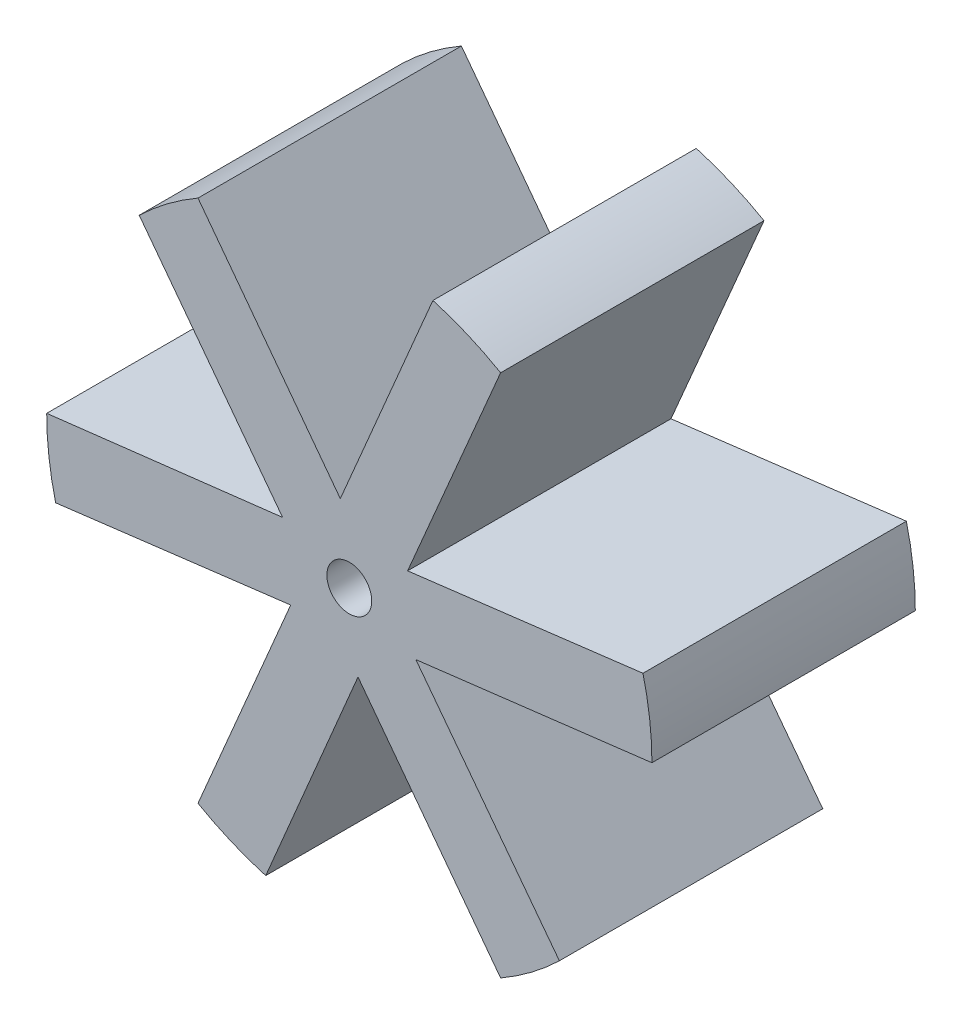
ISO-10303-21;
HEADER;
FILE_DESCRIPTION(('STEP AP214'),'2;1');
FILE_NAME('part.step','',(''),(''),'','','');
FILE_SCHEMA(('AUTOMOTIVE_DESIGN { 1 0 10303 214 1 1 1 1 }'));
ENDSEC;
DATA;
#1=APPLICATION_CONTEXT('core data for automotive mechanical design processes');
#2=APPLICATION_PROTOCOL_DEFINITION('international standard','automotive_design',2000,#1);
#3=PRODUCT_CONTEXT('',#1,'mechanical');
#4=PRODUCT('Part','Part','',(#3));
#5=PRODUCT_RELATED_PRODUCT_CATEGORY('part','',(#4));
#6=PRODUCT_DEFINITION_FORMATION('','',#4);
#7=PRODUCT_DEFINITION_CONTEXT('part definition',#1,'design');
#8=PRODUCT_DEFINITION('design','',#6,#7);
#9=PRODUCT_DEFINITION_SHAPE('','',#8);
#10=(LENGTH_UNIT() NAMED_UNIT(*) SI_UNIT(.MILLI.,.METRE.));
#11=(NAMED_UNIT(*) PLANE_ANGLE_UNIT() SI_UNIT($,.RADIAN.));
#12=(NAMED_UNIT(*) SI_UNIT($,.STERADIAN.) SOLID_ANGLE_UNIT());
#13=UNCERTAINTY_MEASURE_WITH_UNIT(LENGTH_MEASURE(1.E-05),#10,'distance_accuracy_value','');
#14=(GEOMETRIC_REPRESENTATION_CONTEXT(3) GLOBAL_UNCERTAINTY_ASSIGNED_CONTEXT((#13)) GLOBAL_UNIT_ASSIGNED_CONTEXT((#10,
#11,#12)) REPRESENTATION_CONTEXT('',''));
#15=CARTESIAN_POINT('',(0.,0.,0.));
#16=DIRECTION('',(0.,0.,1.));
#17=DIRECTION('',(1.,0.,0.));
#18=AXIS2_PLACEMENT_3D('',#15,#16,#17);
#19=CARTESIAN_POINT('',(2.6131041628514,1.96600077533102,23.5));
#20=DIRECTION('',(0.799093034570553,0.601207386931352,0.));
#21=DIRECTION('',(-0.601207386931352,0.799093034570553,0.));
#22=AXIS2_PLACEMENT_3D('',#19,#20,#21);
#23=PLANE('',#22);
#24=DIRECTION('',(0.601207386931352,-0.799093034570553,0.));
#25=VECTOR('',#24,1.);
#26=CARTESIAN_POINT('',(2.6131041628514,1.96600077533102,0.));
#27=LINE('',#26,#25);
#28=CARTESIAN_POINT('',(-13.5,23.3826859021798,0.));
#29=VERTEX_POINT('',#28);
#30=CARTESIAN_POINT('',(-0.802395417940144,6.5057020230484,0.));
#31=VERTEX_POINT('',#30);
#32=EDGE_CURVE('E200',#29,#31,#27,.T.);
#33=ORIENTED_EDGE('',*,*,#32,.F.);
#34=DIRECTION('',(0.,0.,-1.));
#35=VECTOR('',#34,1.);
#36=CARTESIAN_POINT('',(-13.5,23.3826859021798,23.5));
#37=LINE('',#36,#35);
#38=CARTESIAN_POINT('',(-13.5,23.3826859021798,23.5));
#39=VERTEX_POINT('',#38);
#40=EDGE_CURVE('E11',#39,#29,#37,.T.);
#41=ORIENTED_EDGE('',*,*,#40,.F.);
#42=DIRECTION('',(0.601207386931352,-0.799093034570553,0.));
#43=VECTOR('',#42,1.);
#44=CARTESIAN_POINT('',(2.6131041628514,1.96600077533102,23.5));
#45=LINE('',#44,#43);
#46=CARTESIAN_POINT('',(-0.802395417940144,6.5057020230484,23.5));
#47=VERTEX_POINT('',#46);
#48=EDGE_CURVE('E263',#39,#47,#45,.T.);
#49=ORIENTED_EDGE('',*,*,#48,.T.);
#50=DIRECTION('',(0.,0.,-1.));
#51=VECTOR('',#50,1.);
#52=CARTESIAN_POINT('',(-0.802395417940144,6.5057020230484,23.5));
#53=LINE('',#52,#51);
#54=EDGE_CURVE('E121',#47,#31,#53,.T.);
#55=ORIENTED_EDGE('',*,*,#54,.T.);
#56=EDGE_LOOP('',(#33,#41,#49,#55));
#57=FACE_BOUND('',#56,.T.);
#58=ADVANCED_FACE('F40',(#57),#23,.T.);
#59=CARTESIAN_POINT('',(0.,0.,23.5));
#60=DIRECTION('',(0.,0.,-1.));
#61=DIRECTION('',(-1.,0.,0.));
#62=AXIS2_PLACEMENT_3D('',#59,#60,#61);
#63=CYLINDRICAL_SURFACE('',#62,27.);
#64=CARTESIAN_POINT('',(0.,0.,0.));
#65=DIRECTION('',(0.,0.,1.));
#66=DIRECTION('',(1.,0.,0.));
#67=AXIS2_PLACEMENT_3D('',#64,#65,#66);
#68=CIRCLE('',#67,27.);
#69=CARTESIAN_POINT('',(-18.7440472603665,19.4334940836986,0.));
#70=VERTEX_POINT('',#69);
#71=EDGE_CURVE('E204',#29,#70,#68,.T.);
#72=ORIENTED_EDGE('',*,*,#71,.T.);
#73=DIRECTION('',(0.,0.,-1.));
#74=VECTOR('',#73,1.);
#75=CARTESIAN_POINT('',(-18.7440472603665,19.4334940836986,23.5));
#76=LINE('',#75,#74);
#77=CARTESIAN_POINT('',(-18.7440472603665,19.4334940836986,23.5));
#78=VERTEX_POINT('',#77);
#79=EDGE_CURVE('E49',#78,#70,#76,.T.);
#80=ORIENTED_EDGE('',*,*,#79,.F.);
#81=CARTESIAN_POINT('',(0.,0.,23.5));
#82=DIRECTION('',(0.,0.,1.));
#83=DIRECTION('',(1.,0.,0.));
#84=AXIS2_PLACEMENT_3D('',#81,#82,#83);
#85=CIRCLE('',#84,27.);
#86=EDGE_CURVE('E338',#39,#78,#85,.T.);
#87=ORIENTED_EDGE('',*,*,#86,.F.);
#88=ORIENTED_EDGE('',*,*,#40,.T.);
#89=EDGE_LOOP('',(#72,#80,#87,#88));
#90=FACE_BOUND('',#89,.T.);
#91=ADVANCED_FACE('F404',(#90),#63,.T.);
#92=CARTESIAN_POINT('',(-2.59902119357171,-1.96128524075955,23.5));
#93=DIRECTION('',(0.798224619097573,0.602359906921546,0.));
#94=DIRECTION('',(-0.602359906921547,0.798224619097573,0.));
#95=AXIS2_PLACEMENT_3D('',#92,#93,#94);
#96=PLANE('',#95);
#97=DIRECTION('',(0.602359906921547,-0.798224619097573,0.));
#98=VECTOR('',#97,1.);
#99=CARTESIAN_POINT('',(-2.59902119357171,-1.96128524075955,0.));
#100=LINE('',#99,#98);
#101=CARTESIAN_POINT('',(-5.95313422123392,2.48345877880644,0.));
#102=VERTEX_POINT('',#101);
#103=EDGE_CURVE('E208',#70,#102,#100,.T.);
#104=ORIENTED_EDGE('',*,*,#103,.T.);
#105=DIRECTION('',(0.,0.,-1.));
#106=VECTOR('',#105,1.);
#107=CARTESIAN_POINT('',(-5.95313422123392,2.48345877880644,23.5));
#108=LINE('',#107,#106);
#109=CARTESIAN_POINT('',(-5.95313422123392,2.48345877880644,23.5));
#110=VERTEX_POINT('',#109);
#111=EDGE_CURVE('E307',#110,#102,#108,.T.);
#112=ORIENTED_EDGE('',*,*,#111,.F.);
#113=DIRECTION('',(0.602359906921547,-0.798224619097573,0.));
#114=VECTOR('',#113,1.);
#115=CARTESIAN_POINT('',(-2.59902119357171,-1.96128524075955,23.5));
#116=LINE('',#115,#114);
#117=EDGE_CURVE('E317',#78,#110,#116,.T.);
#118=ORIENTED_EDGE('',*,*,#117,.F.);
#119=ORIENTED_EDGE('',*,*,#79,.T.);
#120=EDGE_LOOP('',(#104,#112,#118,#119));
#121=FACE_BOUND('',#120,.T.);
#122=ADVANCED_FACE('F315',(#121),#96,.F.);
#123=CARTESIAN_POINT('',(-0.370764165397648,3.14215951208615,23.5));
#124=DIRECTION('',(-0.117183642740098,0.993110262697029,0.));
#125=DIRECTION('',(-0.993110262697029,-0.117183642740098,0.));
#126=AXIS2_PLACEMENT_3D('',#123,#124,#125);
#127=PLANE('',#126);
#128=DIRECTION('',(0.993110262697029,0.117183642740098,0.));
#129=VECTOR('',#128,1.);
#130=CARTESIAN_POINT('',(-0.370764165397648,3.14215951208615,0.));
#131=LINE('',#130,#129);
#132=CARTESIAN_POINT('',(-27.,0.,0.));
#133=VERTEX_POINT('',#132);
#134=EDGE_CURVE('E212',#133,#102,#131,.T.);
#135=ORIENTED_EDGE('',*,*,#134,.F.);
#136=DIRECTION('',(0.,0.,-1.));
#137=VECTOR('',#136,1.);
#138=CARTESIAN_POINT('',(-27.,0.,23.5));
#139=LINE('',#138,#137);
#140=CARTESIAN_POINT('',(-27.,0.,23.5));
#141=VERTEX_POINT('',#140);
#142=EDGE_CURVE('E304',#141,#133,#139,.T.);
#143=ORIENTED_EDGE('',*,*,#142,.F.);
#144=DIRECTION('',(0.993110262697029,0.117183642740098,0.));
#145=VECTOR('',#144,1.);
#146=CARTESIAN_POINT('',(-0.370764165397648,3.14215951208615,23.5));
#147=LINE('',#146,#145);
#148=EDGE_CURVE('E330',#141,#110,#147,.T.);
#149=ORIENTED_EDGE('',*,*,#148,.T.);
#150=ORIENTED_EDGE('',*,*,#111,.T.);
#151=EDGE_LOOP('',(#135,#143,#149,#150));
#152=FACE_BOUND('',#151,.T.);
#153=ADVANCED_FACE('F326',(#152),#127,.T.);
#154=CARTESIAN_POINT('',(0.,0.,23.5));
#155=DIRECTION('',(0.,0.,-1.));
#156=DIRECTION('',(-1.,0.,0.));
#157=AXIS2_PLACEMENT_3D('',#154,#155,#156);
#158=CYLINDRICAL_SURFACE('',#157,27.);
#159=CARTESIAN_POINT('',(0.,0.,0.));
#160=DIRECTION('',(0.,0.,1.));
#161=DIRECTION('',(1.,0.,0.));
#162=AXIS2_PLACEMENT_3D('',#159,#160,#161);
#163=CIRCLE('',#162,27.);
#164=CARTESIAN_POINT('',(-26.2019231909608,-6.51607405536417,0.));
#165=VERTEX_POINT('',#164);
#166=EDGE_CURVE('E216',#133,#165,#163,.T.);
#167=ORIENTED_EDGE('',*,*,#166,.T.);
#168=DIRECTION('',(0.,0.,-1.));
#169=VECTOR('',#168,1.);
#170=CARTESIAN_POINT('',(-26.2019231909608,-6.51607405536417,23.5));
#171=LINE('',#170,#169);
#172=CARTESIAN_POINT('',(-26.2019231909608,-6.51607405536417,23.5));
#173=VERTEX_POINT('',#172);
#174=EDGE_CURVE('E300',#173,#165,#171,.T.);
#175=ORIENTED_EDGE('',*,*,#174,.F.);
#176=CARTESIAN_POINT('',(0.,0.,23.5));
#177=DIRECTION('',(0.,0.,1.));
#178=DIRECTION('',(1.,0.,0.));
#179=AXIS2_PLACEMENT_3D('',#176,#177,#178);
#180=CIRCLE('',#179,27.);
#181=EDGE_CURVE('E332',#141,#173,#180,.T.);
#182=ORIENTED_EDGE('',*,*,#181,.F.);
#183=ORIENTED_EDGE('',*,*,#142,.T.);
#184=EDGE_LOOP('',(#167,#175,#182,#183));
#185=FACE_BOUND('',#184,.T.);
#186=ADVANCED_FACE('F415',(#185),#158,.T.);
#187=CARTESIAN_POINT('',(0.399016917611172,-3.23395080619074,23.5));
#188=DIRECTION('',(-0.122455151350707,0.992474047976911,0.));
#189=DIRECTION('',(-0.992474047976911,-0.122455151350707,0.));
#190=AXIS2_PLACEMENT_3D('',#187,#188,#189);
#191=PLANE('',#190);
#192=DIRECTION('',(0.992474047976911,0.122455151350707,0.));
#193=VECTOR('',#192,1.);
#194=CARTESIAN_POINT('',(0.399016917611172,-3.23395080619074,0.));
#195=LINE('',#194,#193);
#196=CARTESIAN_POINT('',(-5.22853538801664,-3.92829920827178,0.));
#197=VERTEX_POINT('',#196);
#198=EDGE_CURVE('E219',#165,#197,#195,.T.);
#199=ORIENTED_EDGE('',*,*,#198,.T.);
#200=DIRECTION('',(0.,0.,-1.));
#201=VECTOR('',#200,1.);
#202=CARTESIAN_POINT('',(-5.22853538801664,-3.92829920827178,23.5));
#203=LINE('',#202,#201);
#204=CARTESIAN_POINT('',(-5.22853538801664,-3.92829920827178,23.5));
#205=VERTEX_POINT('',#204);
#206=EDGE_CURVE('E297',#205,#197,#203,.T.);
#207=ORIENTED_EDGE('',*,*,#206,.F.);
#208=DIRECTION('',(0.992474047976911,0.122455151350707,0.));
#209=VECTOR('',#208,1.);
#210=CARTESIAN_POINT('',(0.399016917611172,-3.23395080619074,23.5));
#211=LINE('',#210,#209);
#212=EDGE_CURVE('E336',#173,#205,#211,.T.);
#213=ORIENTED_EDGE('',*,*,#212,.F.);
#214=ORIENTED_EDGE('',*,*,#174,.T.);
#215=EDGE_LOOP('',(#199,#207,#213,#214));
#216=FACE_BOUND('',#215,.T.);
#217=ADVANCED_FACE('F418',(#216),#191,.F.);
#218=CARTESIAN_POINT('',(-3.01356528322068,1.28128421565029,23.5));
#219=DIRECTION('',(-0.920273858632662,0.391274871563906,0.));
#220=DIRECTION('',(-0.391274871563906,-0.920273858632662,0.));
#221=AXIS2_PLACEMENT_3D('',#218,#219,#220);
#222=PLANE('',#221);
#223=DIRECTION('',(0.391274871563906,0.920273858632662,0.));
#224=VECTOR('',#223,1.);
#225=CARTESIAN_POINT('',(-3.01356528322068,1.28128421565029,0.));
#226=LINE('',#225,#224);
#227=CARTESIAN_POINT('',(-13.5,-23.3826859021798,0.));
#228=VERTEX_POINT('',#227);
#229=EDGE_CURVE('E223',#228,#197,#226,.T.);
#230=ORIENTED_EDGE('',*,*,#229,.F.);
#231=DIRECTION('',(0.,0.,-1.));
#232=VECTOR('',#231,1.);
#233=CARTESIAN_POINT('',(-13.5,-23.3826859021798,23.5));
#234=LINE('',#233,#232);
#235=CARTESIAN_POINT('',(-13.5,-23.3826859021798,23.5));
#236=VERTEX_POINT('',#235);
#237=EDGE_CURVE('E294',#236,#228,#234,.T.);
#238=ORIENTED_EDGE('',*,*,#237,.F.);
#239=DIRECTION('',(0.391274871563906,0.920273858632662,0.));
#240=VECTOR('',#239,1.);
#241=CARTESIAN_POINT('',(-3.01356528322068,1.28128421565029,23.5));
#242=LINE('',#241,#240);
#243=EDGE_CURVE('E344',#236,#205,#242,.T.);
#244=ORIENTED_EDGE('',*,*,#243,.T.);
#245=ORIENTED_EDGE('',*,*,#206,.T.);
#246=EDGE_LOOP('',(#230,#238,#244,#245));
#247=FACE_BOUND('',#246,.T.);
#248=ADVANCED_FACE('F422',(#247),#222,.T.);
#249=CARTESIAN_POINT('',(0.,0.,23.5));
#250=DIRECTION('',(0.,0.,-1.));
#251=DIRECTION('',(-1.,0.,0.));
#252=AXIS2_PLACEMENT_3D('',#249,#250,#251);
#253=CYLINDRICAL_SURFACE('',#252,27.);
#254=CARTESIAN_POINT('',(0.,0.,0.));
#255=DIRECTION('',(0.,0.,1.));
#256=DIRECTION('',(1.,0.,0.));
#257=AXIS2_PLACEMENT_3D('',#254,#255,#256);
#258=CIRCLE('',#257,27.);
#259=CARTESIAN_POINT('',(-7.45787593059434,-25.9495681390628,0.));
#260=VERTEX_POINT('',#259);
#261=EDGE_CURVE('E227',#228,#260,#258,.T.);
#262=ORIENTED_EDGE('',*,*,#261,.T.);
#263=DIRECTION('',(0.,0.,-1.));
#264=VECTOR('',#263,1.);
#265=CARTESIAN_POINT('',(-7.45787593059434,-25.9495681390628,23.5));
#266=LINE('',#265,#264);
#267=CARTESIAN_POINT('',(-7.45787593059434,-25.9495681390628,23.5));
#268=VERTEX_POINT('',#267);
#269=EDGE_CURVE('E290',#268,#260,#266,.T.);
#270=ORIENTED_EDGE('',*,*,#269,.F.);
#271=CARTESIAN_POINT('',(0.,0.,23.5));
#272=DIRECTION('',(0.,0.,1.));
#273=DIRECTION('',(1.,0.,0.));
#274=AXIS2_PLACEMENT_3D('',#271,#272,#273);
#275=CIRCLE('',#274,27.);
#276=EDGE_CURVE('E348',#236,#268,#275,.T.);
#277=ORIENTED_EDGE('',*,*,#276,.F.);
#278=ORIENTED_EDGE('',*,*,#237,.T.);
#279=EDGE_LOOP('',(#262,#270,#277,#278));
#280=FACE_BOUND('',#279,.T.);
#281=ADVANCED_FACE('F426',(#280),#253,.T.);
#282=CARTESIAN_POINT('',(2.98500027119544,-1.26269487261342,23.5));
#283=DIRECTION('',(-0.920988270333335,0.389590305203314,0.));
#284=DIRECTION('',(-0.389590305203314,-0.920988270333336,0.));
#285=AXIS2_PLACEMENT_3D('',#282,#283,#284);
#286=PLANE('',#285);
#287=DIRECTION('',(0.389590305203314,0.920988270333336,0.));
#288=VECTOR('',#287,1.);
#289=CARTESIAN_POINT('',(2.98500027119544,-1.26269487261342,0.));
#290=LINE('',#289,#288);
#291=CARTESIAN_POINT('',(0.775509289672313,-6.48591334137933,0.));
#292=VERTEX_POINT('',#291);
#293=EDGE_CURVE('E230',#260,#292,#290,.T.);
#294=ORIENTED_EDGE('',*,*,#293,.T.);
#295=DIRECTION('',(0.,0.,-1.));
#296=VECTOR('',#295,1.);
#297=CARTESIAN_POINT('',(0.775509289672313,-6.48591334137933,23.5));
#298=LINE('',#297,#296);
#299=CARTESIAN_POINT('',(0.775509289672313,-6.48591334137933,23.5));
#300=VERTEX_POINT('',#299);
#301=EDGE_CURVE('E287',#300,#292,#298,.T.);
#302=ORIENTED_EDGE('',*,*,#301,.F.);
#303=DIRECTION('',(0.389590305203314,0.920988270333336,0.));
#304=VECTOR('',#303,1.);
#305=CARTESIAN_POINT('',(2.98500027119544,-1.26269487261342,23.5));
#306=LINE('',#305,#304);
#307=EDGE_CURVE('E351',#268,#300,#306,.T.);
#308=ORIENTED_EDGE('',*,*,#307,.F.);
#309=ORIENTED_EDGE('',*,*,#269,.T.);
#310=EDGE_LOOP('',(#294,#302,#308,#309));
#311=FACE_BOUND('',#310,.T.);
#312=ADVANCED_FACE('F430',(#311),#286,.F.);
#313=CARTESIAN_POINT('',(-2.62191652389643,-1.97449260392921,23.5));
#314=DIRECTION('',(-0.798820449474529,-0.601569521752317,0.));
#315=DIRECTION('',(0.601569521752317,-0.798820449474529,0.));
#316=AXIS2_PLACEMENT_3D('',#313,#314,#315);
#317=PLANE('',#316);
#318=DIRECTION('',(-0.601569521752317,0.798820449474529,0.));
#319=VECTOR('',#318,1.);
#320=CARTESIAN_POINT('',(-2.62191652389643,-1.97449260392921,0.));
#321=LINE('',#320,#319);
#322=CARTESIAN_POINT('',(13.5,-23.3826859021798,0.));
#323=VERTEX_POINT('',#322);
#324=EDGE_CURVE('E234',#323,#292,#321,.T.);
#325=ORIENTED_EDGE('',*,*,#324,.F.);
#326=DIRECTION('',(0.,0.,-1.));
#327=VECTOR('',#326,1.);
#328=CARTESIAN_POINT('',(13.5,-23.3826859021798,23.5));
#329=LINE('',#328,#327);
#330=CARTESIAN_POINT('',(13.5,-23.3826859021798,23.5));
#331=VERTEX_POINT('',#330);
#332=EDGE_CURVE('E284',#331,#323,#329,.T.);
#333=ORIENTED_EDGE('',*,*,#332,.F.);
#334=DIRECTION('',(-0.601569521752317,0.798820449474529,0.));
#335=VECTOR('',#334,1.);
#336=CARTESIAN_POINT('',(-2.62191652389643,-1.97449260392921,23.5));
#337=LINE('',#336,#335);
#338=EDGE_CURVE('E354',#331,#300,#337,.T.);
#339=ORIENTED_EDGE('',*,*,#338,.T.);
#340=ORIENTED_EDGE('',*,*,#301,.T.);
#341=EDGE_LOOP('',(#325,#333,#339,#340));
#342=FACE_BOUND('',#341,.T.);
#343=ADVANCED_FACE('F434',(#342),#317,.T.);
#344=CARTESIAN_POINT('',(0.,0.,23.5));
#345=DIRECTION('',(0.,0.,-1.));
#346=DIRECTION('',(-1.,0.,0.));
#347=AXIS2_PLACEMENT_3D('',#344,#345,#346);
#348=CYLINDRICAL_SURFACE('',#347,27.);
#349=CARTESIAN_POINT('',(0.,0.,0.));
#350=DIRECTION('',(0.,0.,1.));
#351=DIRECTION('',(1.,0.,0.));
#352=AXIS2_PLACEMENT_3D('',#349,#350,#351);
#353=CIRCLE('',#352,27.);
#354=CARTESIAN_POINT('',(18.7440472603665,-19.4334940836986,0.));
#355=VERTEX_POINT('',#354);
#356=EDGE_CURVE('E238',#323,#355,#353,.T.);
#357=ORIENTED_EDGE('',*,*,#356,.T.);
#358=DIRECTION('',(0.,0.,-1.));
#359=VECTOR('',#358,1.);
#360=CARTESIAN_POINT('',(18.7440472603665,-19.4334940836986,23.5));
#361=LINE('',#360,#359);
#362=CARTESIAN_POINT('',(18.7440472603665,-19.4334940836986,23.5));
#363=VERTEX_POINT('',#362);
#364=EDGE_CURVE('E280',#363,#355,#361,.T.);
#365=ORIENTED_EDGE('',*,*,#364,.F.);
#366=CARTESIAN_POINT('',(0.,0.,23.5));
#367=DIRECTION('',(0.,0.,1.));
#368=DIRECTION('',(1.,0.,0.));
#369=AXIS2_PLACEMENT_3D('',#366,#367,#368);
#370=CIRCLE('',#369,27.);
#371=EDGE_CURVE('E358',#331,#363,#370,.T.);
#372=ORIENTED_EDGE('',*,*,#371,.F.);
#373=ORIENTED_EDGE('',*,*,#332,.T.);
#374=EDGE_LOOP('',(#357,#365,#372,#373));
#375=FACE_BOUND('',#374,.T.);
#376=ADVANCED_FACE('F438',(#375),#348,.T.);
#377=CARTESIAN_POINT('',(2.53489129941406,1.92385524031596,23.5));
#378=DIRECTION('',(-0.796565022742373,-0.604552863315892,0.));
#379=DIRECTION('',(0.604552863315892,-0.796565022742373,0.));
#380=AXIS2_PLACEMENT_3D('',#377,#378,#379);
#381=PLANE('',#380);
#382=DIRECTION('',(-0.604552863315892,0.796565022742373,0.));
#383=VECTOR('',#382,1.);
#384=CARTESIAN_POINT('',(2.53489129941406,1.92385524031596,0.));
#385=LINE('',#384,#383);
#386=CARTESIAN_POINT('',(5.938212823907,-2.56039593449121,0.));
#387=VERTEX_POINT('',#386);
#388=EDGE_CURVE('E241',#355,#387,#385,.T.);
#389=ORIENTED_EDGE('',*,*,#388,.T.);
#390=DIRECTION('',(0.,0.,-1.));
#391=VECTOR('',#390,1.);
#392=CARTESIAN_POINT('',(5.938212823907,-2.56039593449121,23.5));
#393=LINE('',#392,#391);
#394=CARTESIAN_POINT('',(5.938212823907,-2.56039593449121,23.5));
#395=VERTEX_POINT('',#394);
#396=EDGE_CURVE('E277',#395,#387,#393,.T.);
#397=ORIENTED_EDGE('',*,*,#396,.F.);
#398=DIRECTION('',(-0.604552863315892,0.796565022742373,0.));
#399=VECTOR('',#398,1.);
#400=CARTESIAN_POINT('',(2.53489129941406,1.92385524031596,23.5));
#401=LINE('',#400,#399);
#402=EDGE_CURVE('E361',#363,#395,#401,.T.);
#403=ORIENTED_EDGE('',*,*,#402,.F.);
#404=ORIENTED_EDGE('',*,*,#364,.T.);
#405=EDGE_LOOP('',(#389,#397,#403,#404));
#406=FACE_BOUND('',#405,.T.);
#407=ADVANCED_FACE('F442',(#406),#381,.F.);
#408=CARTESIAN_POINT('',(0.393202635324515,-3.23448030467581,23.5));
#409=DIRECTION('',(0.120677506468996,-0.992691764563616,0.));
#410=DIRECTION('',(0.992691764563616,0.120677506468996,0.));
#411=AXIS2_PLACEMENT_3D('',#408,#409,#410);
#412=PLANE('',#411);
#413=DIRECTION('',(-0.992691764563616,-0.120677506468996,0.));
#414=VECTOR('',#413,1.);
#415=CARTESIAN_POINT('',(0.393202635324515,-3.23448030467581,0.));
#416=LINE('',#415,#414);
#417=CARTESIAN_POINT('',(27.,0.,0.));
#418=VERTEX_POINT('',#417);
#419=EDGE_CURVE('E245',#418,#387,#416,.T.);
#420=ORIENTED_EDGE('',*,*,#419,.F.);
#421=DIRECTION('',(0.,0.,-1.));
#422=VECTOR('',#421,1.);
#423=CARTESIAN_POINT('',(27.,0.,23.5));
#424=LINE('',#423,#422);
#425=CARTESIAN_POINT('',(27.,0.,23.5));
#426=VERTEX_POINT('',#425);
#427=EDGE_CURVE('E274',#426,#418,#424,.T.);
#428=ORIENTED_EDGE('',*,*,#427,.F.);
#429=DIRECTION('',(-0.992691764563616,-0.120677506468996,0.));
#430=VECTOR('',#429,1.);
#431=CARTESIAN_POINT('',(0.393202635324515,-3.23448030467581,23.5));
#432=LINE('',#431,#430);
#433=EDGE_CURVE('E364',#426,#395,#432,.T.);
#434=ORIENTED_EDGE('',*,*,#433,.T.);
#435=ORIENTED_EDGE('',*,*,#396,.T.);
#436=EDGE_LOOP('',(#420,#428,#434,#435));
#437=FACE_BOUND('',#436,.T.);
#438=ADVANCED_FACE('F446',(#437),#412,.T.);
#439=CARTESIAN_POINT('',(0.,0.,23.5));
#440=DIRECTION('',(0.,0.,-1.));
#441=DIRECTION('',(-1.,0.,0.));
#442=AXIS2_PLACEMENT_3D('',#439,#440,#441);
#443=CYLINDRICAL_SURFACE('',#442,27.);
#444=CARTESIAN_POINT('',(0.,0.,0.));
#445=DIRECTION('',(0.,0.,1.));
#446=DIRECTION('',(1.,0.,0.));
#447=AXIS2_PLACEMENT_3D('',#444,#445,#446);
#448=CIRCLE('',#447,27.);
#449=CARTESIAN_POINT('',(26.2019231909608,6.51607405536418,0.));
#450=VERTEX_POINT('',#449);
#451=EDGE_CURVE('E249',#418,#450,#448,.T.);
#452=ORIENTED_EDGE('',*,*,#451,.T.);
#453=DIRECTION('',(0.,0.,-1.));
#454=VECTOR('',#453,1.);
#455=CARTESIAN_POINT('',(26.2019231909608,6.51607405536418,23.5));
#456=LINE('',#455,#454);
#457=CARTESIAN_POINT('',(26.2019231909608,6.51607405536418,23.5));
#458=VERTEX_POINT('',#457);
#459=EDGE_CURVE('E270',#458,#450,#456,.T.);
#460=ORIENTED_EDGE('',*,*,#459,.F.);
#461=CARTESIAN_POINT('',(0.,0.,23.5));
#462=DIRECTION('',(0.,0.,1.));
#463=DIRECTION('',(1.,0.,0.));
#464=AXIS2_PLACEMENT_3D('',#461,#462,#463);
#465=CIRCLE('',#464,27.);
#466=EDGE_CURVE('E194',#426,#458,#465,.T.);
#467=ORIENTED_EDGE('',*,*,#466,.F.);
#468=ORIENTED_EDGE('',*,*,#427,.T.);
#469=EDGE_LOOP('',(#452,#460,#467,#468));
#470=FACE_BOUND('',#469,.T.);
#471=ADVANCED_FACE('F372',(#470),#443,.T.);
#472=CARTESIAN_POINT('',(-0.39902329597041,3.23783973579095,23.5));
#473=DIRECTION('',(0.122312199454781,-0.992491675463595,0.));
#474=DIRECTION('',(0.992491675463595,0.122312199454781,0.));
#475=AXIS2_PLACEMENT_3D('',#472,#473,#474);
#476=PLANE('',#475);
#477=DIRECTION('',(-0.992491675463595,-0.122312199454781,0.));
#478=VECTOR('',#477,1.);
#479=CARTESIAN_POINT('',(-0.39902329597041,3.23783973579095,0.));
#480=LINE('',#479,#478);
#481=CARTESIAN_POINT('',(5.20095141063943,3.92796665593529,0.));
#482=VERTEX_POINT('',#481);
#483=EDGE_CURVE('E252',#450,#482,#480,.T.);
#484=ORIENTED_EDGE('',*,*,#483,.T.);
#485=DIRECTION('',(0.,0.,-1.));
#486=VECTOR('',#485,1.);
#487=CARTESIAN_POINT('',(5.20095141063943,3.92796665593529,23.5));
#488=LINE('',#487,#486);
#489=CARTESIAN_POINT('',(5.20095141063943,3.92796665593529,23.5));
#490=VERTEX_POINT('',#489);
#491=EDGE_CURVE('E180',#490,#482,#488,.T.);
#492=ORIENTED_EDGE('',*,*,#491,.F.);
#493=DIRECTION('',(-0.992491675463595,-0.122312199454781,0.));
#494=VECTOR('',#493,1.);
#495=CARTESIAN_POINT('',(-0.39902329597041,3.23783973579095,23.5));
#496=LINE('',#495,#494);
#497=EDGE_CURVE('E189',#458,#490,#496,.T.);
#498=ORIENTED_EDGE('',*,*,#497,.F.);
#499=ORIENTED_EDGE('',*,*,#459,.T.);
#500=EDGE_LOOP('',(#484,#492,#498,#499));
#501=FACE_BOUND('',#500,.T.);
#502=ADVANCED_FACE('F376',(#501),#476,.F.);
#503=CARTESIAN_POINT('',(2.98259667953977,-1.27232443977541,23.5));
#504=DIRECTION('',(0.919806010676551,-0.392373422549602,0.));
#505=DIRECTION('',(0.392373422549603,0.919806010676551,0.));
#506=AXIS2_PLACEMENT_3D('',#503,#504,#505);
#507=PLANE('',#506);
#508=DIRECTION('',(-0.392373422549603,-0.919806010676551,0.));
#509=VECTOR('',#508,1.);
#510=CARTESIAN_POINT('',(2.98259667953977,-1.27232443977541,0.));
#511=LINE('',#510,#509);
#512=CARTESIAN_POINT('',(13.5,23.3826859021798,0.));
#513=VERTEX_POINT('',#512);
#514=EDGE_CURVE('E178',#513,#482,#511,.T.);
#515=ORIENTED_EDGE('',*,*,#514,.F.);
#516=DIRECTION('',(0.,0.,-1.));
#517=VECTOR('',#516,1.);
#518=CARTESIAN_POINT('',(13.5,23.3826859021798,23.5));
#519=LINE('',#518,#517);
#520=CARTESIAN_POINT('',(13.5,23.3826859021798,23.5));
#521=VERTEX_POINT('',#520);
#522=EDGE_CURVE('E172',#521,#513,#519,.T.);
#523=ORIENTED_EDGE('',*,*,#522,.F.);
#524=DIRECTION('',(-0.392373422549603,-0.919806010676551,0.));
#525=VECTOR('',#524,1.);
#526=CARTESIAN_POINT('',(2.98259667953977,-1.27232443977541,23.5));
#527=LINE('',#526,#525);
#528=EDGE_CURVE('E176',#521,#490,#527,.T.);
#529=ORIENTED_EDGE('',*,*,#528,.T.);
#530=ORIENTED_EDGE('',*,*,#491,.T.);
#531=EDGE_LOOP('',(#515,#523,#529,#530));
#532=FACE_BOUND('',#531,.T.);
#533=ADVANCED_FACE('F174',(#532),#507,.T.);
#534=CARTESIAN_POINT('',(0.,0.,23.5));
#535=DIRECTION('',(0.,0.,-1.));
#536=DIRECTION('',(-1.,0.,0.));
#537=AXIS2_PLACEMENT_3D('',#534,#535,#536);
#538=CYLINDRICAL_SURFACE('',#537,27.);
#539=CARTESIAN_POINT('',(0.,0.,0.));
#540=DIRECTION('',(0.,0.,1.));
#541=DIRECTION('',(1.,0.,0.));
#542=AXIS2_PLACEMENT_3D('',#539,#540,#541);
#543=CIRCLE('',#542,27.);
#544=CARTESIAN_POINT('',(7.45787593059435,25.9495681390628,0.));
#545=VERTEX_POINT('',#544);
#546=EDGE_CURVE('E114',#513,#545,#543,.T.);
#547=ORIENTED_EDGE('',*,*,#546,.T.);
#548=DIRECTION('',(0.,0.,-1.));
#549=VECTOR('',#548,1.);
#550=CARTESIAN_POINT('',(7.45787593059435,25.9495681390628,23.5));
#551=LINE('',#550,#549);
#552=CARTESIAN_POINT('',(7.45787593059435,25.9495681390628,23.5));
#553=VERTEX_POINT('',#552);
#554=EDGE_CURVE('E181',#553,#545,#551,.T.);
#555=ORIENTED_EDGE('',*,*,#554,.F.);
#556=CARTESIAN_POINT('',(0.,0.,23.5));
#557=DIRECTION('',(0.,0.,1.));
#558=DIRECTION('',(1.,0.,0.));
#559=AXIS2_PLACEMENT_3D('',#556,#557,#558);
#560=CIRCLE('',#559,27.);
#561=EDGE_CURVE('E183',#521,#553,#560,.T.);
#562=ORIENTED_EDGE('',*,*,#561,.F.);
#563=ORIENTED_EDGE('',*,*,#522,.T.);
#564=EDGE_LOOP('',(#547,#555,#562,#563));
#565=FACE_BOUND('',#564,.T.);
#566=ADVANCED_FACE('F184',(#565),#538,.T.);
#567=CARTESIAN_POINT('',(-3.02097263904789,1.28338950629172,23.5));
#568=DIRECTION('',(0.920388362615437,-0.391005450041397,0.));
#569=DIRECTION('',(0.391005450041397,0.920388362615437,0.));
#570=AXIS2_PLACEMENT_3D('',#567,#568,#569);
#571=PLANE('',#570);
#572=DIRECTION('',(-0.391005450041397,-0.920388362615437,0.));
#573=VECTOR('',#572,1.);
#574=CARTESIAN_POINT('',(-3.02097263904789,1.28338950629172,0.));
#575=LINE('',#574,#573);
#576=EDGE_CURVE('E260',#545,#31,#575,.T.);
#577=ORIENTED_EDGE('',*,*,#576,.T.);
#578=ORIENTED_EDGE('',*,*,#54,.F.);
#579=DIRECTION('',(-0.391005450041397,-0.920388362615437,0.));
#580=VECTOR('',#579,1.);
#581=CARTESIAN_POINT('',(-3.02097263904789,1.28338950629172,23.5));
#582=LINE('',#581,#580);
#583=EDGE_CURVE('E57',#553,#47,#582,.T.);
#584=ORIENTED_EDGE('',*,*,#583,.F.);
#585=ORIENTED_EDGE('',*,*,#554,.T.);
#586=EDGE_LOOP('',(#577,#578,#584,#585));
#587=FACE_BOUND('',#586,.T.);
#588=ADVANCED_FACE('F379',(#587),#571,.F.);
#589=CARTESIAN_POINT('',(0.,0.,23.5));
#590=DIRECTION('',(0.,0.,1.));
#591=DIRECTION('',(1.,0.,0.));
#592=AXIS2_PLACEMENT_3D('',#589,#590,#591);
#593=PLANE('',#592);
#594=CARTESIAN_POINT('',(0.,0.,23.5));
#595=DIRECTION('',(0.,0.,1.));
#596=DIRECTION('',(1.,0.,0.));
#597=AXIS2_PLACEMENT_3D('',#594,#595,#596);
#598=CIRCLE('',#597,2.);
#599=CARTESIAN_POINT('',(2.,0.,23.5));
#600=VERTEX_POINT('',#599);
#601=EDGE_CURVE('E205',#600,#600,#598,.T.);
#602=ORIENTED_EDGE('',*,*,#601,.F.);
#603=EDGE_LOOP('',(#602));
#604=FACE_BOUND('',#603,.T.);
#605=ORIENTED_EDGE('',*,*,#48,.F.);
#606=ORIENTED_EDGE('',*,*,#86,.T.);
#607=ORIENTED_EDGE('',*,*,#117,.T.);
#608=ORIENTED_EDGE('',*,*,#148,.F.);
#609=ORIENTED_EDGE('',*,*,#181,.T.);
#610=ORIENTED_EDGE('',*,*,#212,.T.);
#611=ORIENTED_EDGE('',*,*,#243,.F.);
#612=ORIENTED_EDGE('',*,*,#276,.T.);
#613=ORIENTED_EDGE('',*,*,#307,.T.);
#614=ORIENTED_EDGE('',*,*,#338,.F.);
#615=ORIENTED_EDGE('',*,*,#371,.T.);
#616=ORIENTED_EDGE('',*,*,#402,.T.);
#617=ORIENTED_EDGE('',*,*,#433,.F.);
#618=ORIENTED_EDGE('',*,*,#466,.T.);
#619=ORIENTED_EDGE('',*,*,#497,.T.);
#620=ORIENTED_EDGE('',*,*,#528,.F.);
#621=ORIENTED_EDGE('',*,*,#561,.T.);
#622=ORIENTED_EDGE('',*,*,#583,.T.);
#623=EDGE_LOOP('',(#605,#606,#607,#608,#609,#610,#611,#612,#613,#614,#615,#616,#617,#618,#619,
#620,#621,#622));
#624=FACE_BOUND('',#623,.T.);
#625=ADVANCED_FACE('F187',(#604,#624),#593,.T.);
#626=CARTESIAN_POINT('',(0.,0.,0.));
#627=DIRECTION('',(0.,0.,1.));
#628=DIRECTION('',(1.,0.,0.));
#629=AXIS2_PLACEMENT_3D('',#626,#627,#628);
#630=PLANE('',#629);
#631=CARTESIAN_POINT('',(0.,0.,0.));
#632=DIRECTION('',(0.,0.,1.));
#633=DIRECTION('',(1.,0.,0.));
#634=AXIS2_PLACEMENT_3D('',#631,#632,#633);
#635=CIRCLE('',#634,2.);
#636=CARTESIAN_POINT('',(2.,0.,0.));
#637=VERTEX_POINT('',#636);
#638=EDGE_CURVE('E387',#637,#637,#635,.T.);
#639=ORIENTED_EDGE('',*,*,#638,.T.);
#640=EDGE_LOOP('',(#639));
#641=FACE_BOUND('',#640,.T.);
#642=ORIENTED_EDGE('',*,*,#32,.T.);
#643=ORIENTED_EDGE('',*,*,#576,.F.);
#644=ORIENTED_EDGE('',*,*,#546,.F.);
#645=ORIENTED_EDGE('',*,*,#514,.T.);
#646=ORIENTED_EDGE('',*,*,#483,.F.);
#647=ORIENTED_EDGE('',*,*,#451,.F.);
#648=ORIENTED_EDGE('',*,*,#419,.T.);
#649=ORIENTED_EDGE('',*,*,#388,.F.);
#650=ORIENTED_EDGE('',*,*,#356,.F.);
#651=ORIENTED_EDGE('',*,*,#324,.T.);
#652=ORIENTED_EDGE('',*,*,#293,.F.);
#653=ORIENTED_EDGE('',*,*,#261,.F.);
#654=ORIENTED_EDGE('',*,*,#229,.T.);
#655=ORIENTED_EDGE('',*,*,#198,.F.);
#656=ORIENTED_EDGE('',*,*,#166,.F.);
#657=ORIENTED_EDGE('',*,*,#134,.T.);
#658=ORIENTED_EDGE('',*,*,#103,.F.);
#659=ORIENTED_EDGE('',*,*,#71,.F.);
#660=EDGE_LOOP('',(#642,#643,#644,#645,#646,#647,#648,#649,#650,#651,#652,#653,#654,#655,#656,
#657,#658,#659));
#661=FACE_BOUND('',#660,.T.);
#662=ADVANCED_FACE('F321',(#641,#661),#630,.F.);
#663=CARTESIAN_POINT('',(0.,0.,0.));
#664=DIRECTION('',(0.,0.,1.));
#665=DIRECTION('',(1.,0.,0.));
#666=AXIS2_PLACEMENT_3D('',#663,#664,#665);
#667=CYLINDRICAL_SURFACE('',#666,2.);
#668=ORIENTED_EDGE('',*,*,#601,.T.);
#669=EDGE_LOOP('',(#668));
#670=FACE_BOUND('',#669,.T.);
#671=ORIENTED_EDGE('',*,*,#638,.F.);
#672=EDGE_LOOP('',(#671));
#673=FACE_BOUND('',#672,.T.);
#674=ADVANCED_FACE('F393',(#670,#673),#667,.F.);
#675=CLOSED_SHELL('',(#58,#91,#122,#153,#186,#217,#248,#281,#312,#343,#376,#407,#438,#471,#502,
#533,#566,#588,#625,#662,#674));
#676=MANIFOLD_SOLID_BREP('B2',#675);
#677=ADVANCED_BREP_SHAPE_REPRESENTATION('',(#18,#676),#14);
#678=SHAPE_DEFINITION_REPRESENTATION(#9,#677);
ENDSEC;
END-ISO-10303-21;
